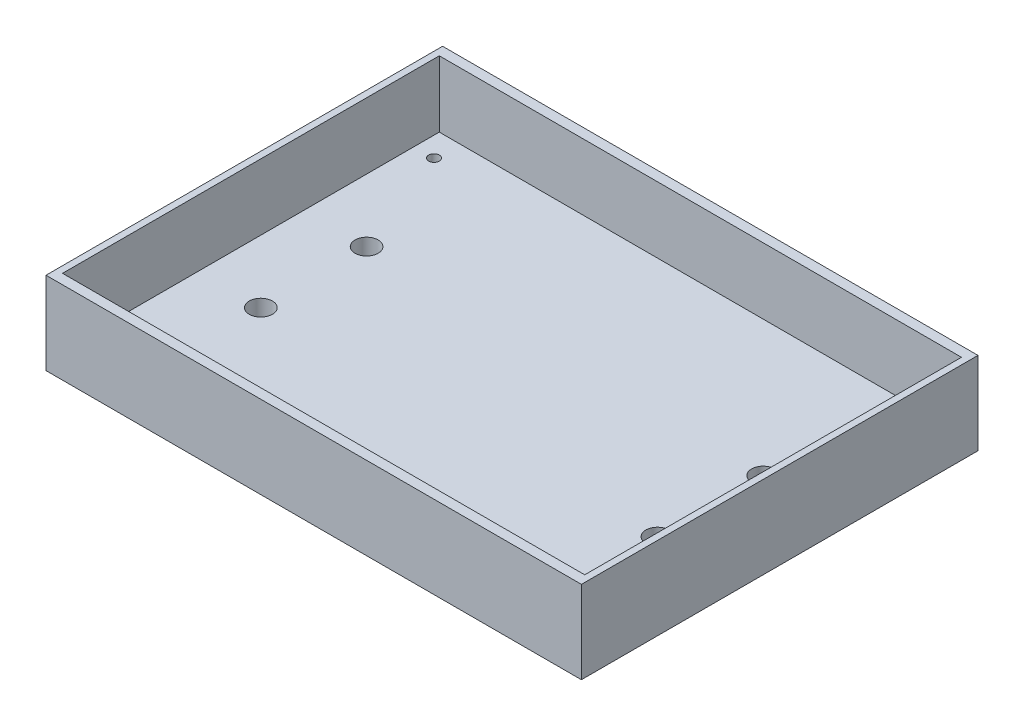
ISO-10303-21;
HEADER;
FILE_DESCRIPTION(('STEP AP214'),'2;1');
FILE_NAME('part.step','',(''),(''),'','','');
FILE_SCHEMA(('AUTOMOTIVE_DESIGN { 1 0 10303 214 1 1 1 1 }'));
ENDSEC;
DATA;
#1=APPLICATION_CONTEXT('core data for automotive mechanical design processes');
#2=APPLICATION_PROTOCOL_DEFINITION('international standard','automotive_design',2000,#1);
#3=PRODUCT_CONTEXT('',#1,'mechanical');
#4=PRODUCT('Part','Part','',(#3));
#5=PRODUCT_RELATED_PRODUCT_CATEGORY('part','',(#4));
#6=PRODUCT_DEFINITION_FORMATION('','',#4);
#7=PRODUCT_DEFINITION_CONTEXT('part definition',#1,'design');
#8=PRODUCT_DEFINITION('design','',#6,#7);
#9=PRODUCT_DEFINITION_SHAPE('','',#8);
#10=(LENGTH_UNIT() NAMED_UNIT(*) SI_UNIT(.MILLI.,.METRE.));
#11=(NAMED_UNIT(*) PLANE_ANGLE_UNIT() SI_UNIT($,.RADIAN.));
#12=(NAMED_UNIT(*) SI_UNIT($,.STERADIAN.) SOLID_ANGLE_UNIT());
#13=UNCERTAINTY_MEASURE_WITH_UNIT(LENGTH_MEASURE(1.E-05),#10,'distance_accuracy_value','');
#14=(GEOMETRIC_REPRESENTATION_CONTEXT(3) GLOBAL_UNCERTAINTY_ASSIGNED_CONTEXT((#13)) GLOBAL_UNIT_ASSIGNED_CONTEXT((#10,
#11,#12)) REPRESENTATION_CONTEXT('',''));
#15=CARTESIAN_POINT('',(0.,0.,0.));
#16=DIRECTION('',(0.,0.,1.));
#17=DIRECTION('',(1.,0.,0.));
#18=AXIS2_PLACEMENT_3D('',#15,#16,#17);
#19=CARTESIAN_POINT('',(0.,3.175,38.1));
#20=DIRECTION('',(0.,0.,-1.));
#21=DIRECTION('',(-1.,0.,0.));
#22=AXIS2_PLACEMENT_3D('',#19,#20,#21);
#23=PLANE('',#22);
#24=DIRECTION('',(1.,0.,0.));
#25=VECTOR('',#24,1.);
#26=CARTESIAN_POINT('',(0.,0.,38.1));
#27=LINE('',#26,#25);
#28=CARTESIAN_POINT('',(-51.435,0.,38.1));
#29=VERTEX_POINT('',#28);
#30=CARTESIAN_POINT('',(51.435,0.,38.1));
#31=VERTEX_POINT('',#30);
#32=EDGE_CURVE('E215',#29,#31,#27,.T.);
#33=ORIENTED_EDGE('',*,*,#32,.T.);
#34=DIRECTION('',(0.,-1.,0.));
#35=VECTOR('',#34,1.);
#36=CARTESIAN_POINT('',(51.435,3.175,38.1));
#37=LINE('',#36,#35);
#38=CARTESIAN_POINT('',(51.435,15.875,38.1));
#39=VERTEX_POINT('',#38);
#40=EDGE_CURVE('E11',#39,#31,#37,.T.);
#41=ORIENTED_EDGE('',*,*,#40,.F.);
#42=DIRECTION('',(1.,0.,0.));
#43=VECTOR('',#42,1.);
#44=CARTESIAN_POINT('',(51.435,15.875,38.1));
#45=LINE('',#44,#43);
#46=CARTESIAN_POINT('',(-51.435,15.875,38.1));
#47=VERTEX_POINT('',#46);
#48=EDGE_CURVE('E161',#47,#39,#45,.T.);
#49=ORIENTED_EDGE('',*,*,#48,.F.);
#50=DIRECTION('',(0.,-1.,0.));
#51=VECTOR('',#50,1.);
#52=CARTESIAN_POINT('',(-51.435,3.175,38.1));
#53=LINE('',#52,#51);
#54=EDGE_CURVE('E207',#47,#29,#53,.T.);
#55=ORIENTED_EDGE('',*,*,#54,.T.);
#56=EDGE_LOOP('',(#33,#41,#49,#55));
#57=FACE_BOUND('',#56,.T.);
#58=ADVANCED_FACE('F45',(#57),#23,.F.);
#59=CARTESIAN_POINT('',(51.435,3.175,0.));
#60=DIRECTION('',(1.,0.,0.));
#61=DIRECTION('',(0.,0.,-1.));
#62=AXIS2_PLACEMENT_3D('',#59,#60,#61);
#63=PLANE('',#62);
#64=DIRECTION('',(0.,0.,1.));
#65=VECTOR('',#64,1.);
#66=CARTESIAN_POINT('',(51.435,0.,0.));
#67=LINE('',#66,#65);
#68=CARTESIAN_POINT('',(51.435,0.,-38.1));
#69=VERTEX_POINT('',#68);
#70=EDGE_CURVE('E219',#69,#31,#67,.T.);
#71=ORIENTED_EDGE('',*,*,#70,.F.);
#72=DIRECTION('',(0.,-1.,0.));
#73=VECTOR('',#72,1.);
#74=CARTESIAN_POINT('',(51.435,3.175,-38.1));
#75=LINE('',#74,#73);
#76=CARTESIAN_POINT('',(51.435,15.875,-38.1));
#77=VERTEX_POINT('',#76);
#78=EDGE_CURVE('E54',#77,#69,#75,.T.);
#79=ORIENTED_EDGE('',*,*,#78,.F.);
#80=DIRECTION('',(0.,0.,-1.));
#81=VECTOR('',#80,1.);
#82=CARTESIAN_POINT('',(51.435,15.875,38.1));
#83=LINE('',#82,#81);
#84=EDGE_CURVE('E165',#39,#77,#83,.T.);
#85=ORIENTED_EDGE('',*,*,#84,.F.);
#86=ORIENTED_EDGE('',*,*,#40,.T.);
#87=EDGE_LOOP('',(#71,#79,#85,#86));
#88=FACE_BOUND('',#87,.T.);
#89=ADVANCED_FACE('F266',(#88),#63,.T.);
#90=CARTESIAN_POINT('',(0.,3.175,-38.1));
#91=DIRECTION('',(0.,0.,-1.));
#92=DIRECTION('',(-1.,0.,0.));
#93=AXIS2_PLACEMENT_3D('',#90,#91,#92);
#94=PLANE('',#93);
#95=DIRECTION('',(1.,0.,0.));
#96=VECTOR('',#95,1.);
#97=CARTESIAN_POINT('',(0.,0.,-38.1));
#98=LINE('',#97,#96);
#99=CARTESIAN_POINT('',(-51.435,0.,-38.1));
#100=VERTEX_POINT('',#99);
#101=EDGE_CURVE('E223',#100,#69,#98,.T.);
#102=ORIENTED_EDGE('',*,*,#101,.F.);
#103=DIRECTION('',(0.,-1.,0.));
#104=VECTOR('',#103,1.);
#105=CARTESIAN_POINT('',(-51.435,3.175,-38.1));
#106=LINE('',#105,#104);
#107=CARTESIAN_POINT('',(-51.435,15.875,-38.1));
#108=VERTEX_POINT('',#107);
#109=EDGE_CURVE('E256',#108,#100,#106,.T.);
#110=ORIENTED_EDGE('',*,*,#109,.F.);
#111=DIRECTION('',(-1.,0.,0.));
#112=VECTOR('',#111,1.);
#113=CARTESIAN_POINT('',(51.435,15.875,-38.1));
#114=LINE('',#113,#112);
#115=EDGE_CURVE('E169',#77,#108,#114,.T.);
#116=ORIENTED_EDGE('',*,*,#115,.F.);
#117=ORIENTED_EDGE('',*,*,#78,.T.);
#118=EDGE_LOOP('',(#102,#110,#116,#117));
#119=FACE_BOUND('',#118,.T.);
#120=ADVANCED_FACE('F263',(#119),#94,.T.);
#121=CARTESIAN_POINT('',(46.355,3.175,31.369));
#122=DIRECTION('',(0.,-1.,0.));
#123=DIRECTION('',(0.,0.,-1.));
#124=AXIS2_PLACEMENT_3D('',#121,#122,#123);
#125=CYLINDRICAL_SURFACE('',#124,1.01599999999998);
#126=CARTESIAN_POINT('',(46.355,3.175,31.369));
#127=DIRECTION('',(0.,1.,0.));
#128=DIRECTION('',(0.,0.,1.));
#129=AXIS2_PLACEMENT_3D('',#126,#127,#128);
#130=CIRCLE('',#129,1.01599999999998);
#131=CARTESIAN_POINT('',(46.355,3.175,32.385));
#132=VERTEX_POINT('',#131);
#133=EDGE_CURVE('E199',#132,#132,#130,.T.);
#134=ORIENTED_EDGE('',*,*,#133,.T.);
#135=EDGE_LOOP('',(#134));
#136=FACE_BOUND('',#135,.T.);
#137=CARTESIAN_POINT('',(46.355,0.,31.369));
#138=DIRECTION('',(0.,1.,0.));
#139=DIRECTION('',(0.,0.,1.));
#140=AXIS2_PLACEMENT_3D('',#137,#138,#139);
#141=CIRCLE('',#140,1.01599999999998);
#142=CARTESIAN_POINT('',(46.355,0.,32.385));
#143=VERTEX_POINT('',#142);
#144=EDGE_CURVE('E246',#143,#143,#141,.T.);
#145=ORIENTED_EDGE('',*,*,#144,.F.);
#146=EDGE_LOOP('',(#145));
#147=FACE_BOUND('',#146,.T.);
#148=ADVANCED_FACE('F334',(#136,#147),#125,.F.);
#149=CARTESIAN_POINT('',(-46.355,3.175,31.369));
#150=DIRECTION('',(0.,-1.,0.));
#151=DIRECTION('',(0.,0.,-1.));
#152=AXIS2_PLACEMENT_3D('',#149,#150,#151);
#153=CYLINDRICAL_SURFACE('',#152,1.016);
#154=CARTESIAN_POINT('',(-46.355,3.175,31.369));
#155=DIRECTION('',(0.,1.,0.));
#156=DIRECTION('',(0.,0.,1.));
#157=AXIS2_PLACEMENT_3D('',#154,#155,#156);
#158=CIRCLE('',#157,1.016);
#159=CARTESIAN_POINT('',(-46.355,3.175,32.385));
#160=VERTEX_POINT('',#159);
#161=EDGE_CURVE('E195',#160,#160,#158,.F.);
#162=ORIENTED_EDGE('',*,*,#161,.F.);
#163=EDGE_LOOP('',(#162));
#164=FACE_BOUND('',#163,.T.);
#165=CARTESIAN_POINT('',(-46.355,0.,31.369));
#166=DIRECTION('',(0.,1.,0.));
#167=DIRECTION('',(0.,0.,1.));
#168=AXIS2_PLACEMENT_3D('',#165,#166,#167);
#169=CIRCLE('',#168,1.016);
#170=CARTESIAN_POINT('',(-46.355,0.,32.385));
#171=VERTEX_POINT('',#170);
#172=EDGE_CURVE('E242',#171,#171,#169,.F.);
#173=ORIENTED_EDGE('',*,*,#172,.T.);
#174=EDGE_LOOP('',(#173));
#175=FACE_BOUND('',#174,.T.);
#176=ADVANCED_FACE('F337',(#164,#175),#153,.F.);
#177=CARTESIAN_POINT('',(-46.355,3.175,-31.369));
#178=DIRECTION('',(0.,-1.,0.));
#179=DIRECTION('',(0.,0.,-1.));
#180=AXIS2_PLACEMENT_3D('',#177,#178,#179);
#181=CYLINDRICAL_SURFACE('',#180,1.016);
#182=CARTESIAN_POINT('',(-46.355,3.175,-31.369));
#183=DIRECTION('',(0.,1.,0.));
#184=DIRECTION('',(0.,0.,1.));
#185=AXIS2_PLACEMENT_3D('',#182,#183,#184);
#186=CIRCLE('',#185,1.016);
#187=CARTESIAN_POINT('',(-46.355,3.175,-30.353));
#188=VERTEX_POINT('',#187);
#189=EDGE_CURVE('E191',#188,#188,#186,.T.);
#190=ORIENTED_EDGE('',*,*,#189,.T.);
#191=EDGE_LOOP('',(#190));
#192=FACE_BOUND('',#191,.T.);
#193=CARTESIAN_POINT('',(-46.355,0.,-31.369));
#194=DIRECTION('',(0.,1.,0.));
#195=DIRECTION('',(0.,0.,1.));
#196=AXIS2_PLACEMENT_3D('',#193,#194,#195);
#197=CIRCLE('',#196,1.016);
#198=CARTESIAN_POINT('',(-46.355,0.,-30.353));
#199=VERTEX_POINT('',#198);
#200=EDGE_CURVE('E238',#199,#199,#197,.T.);
#201=ORIENTED_EDGE('',*,*,#200,.F.);
#202=EDGE_LOOP('',(#201));
#203=FACE_BOUND('',#202,.T.);
#204=ADVANCED_FACE('F341',(#192,#203),#181,.F.);
#205=CARTESIAN_POINT('',(38.1,3.175,-10.16));
#206=DIRECTION('',(0.,-1.,0.));
#207=DIRECTION('',(0.,0.,-1.));
#208=AXIS2_PLACEMENT_3D('',#205,#206,#207);
#209=CYLINDRICAL_SURFACE('',#208,2.22249999999999);
#210=CARTESIAN_POINT('',(38.1,3.175,-10.16));
#211=DIRECTION('',(0.,1.,0.));
#212=DIRECTION('',(0.,0.,1.));
#213=AXIS2_PLACEMENT_3D('',#210,#211,#212);
#214=CIRCLE('',#213,2.22249999999999);
#215=CARTESIAN_POINT('',(38.1,3.175,-7.93750000000002));
#216=VERTEX_POINT('',#215);
#217=EDGE_CURVE('E187',#216,#216,#214,.F.);
#218=ORIENTED_EDGE('',*,*,#217,.F.);
#219=EDGE_LOOP('',(#218));
#220=FACE_BOUND('',#219,.T.);
#221=CARTESIAN_POINT('',(38.1,0.,-10.16));
#222=DIRECTION('',(0.,1.,0.));
#223=DIRECTION('',(0.,0.,1.));
#224=AXIS2_PLACEMENT_3D('',#221,#222,#223);
#225=CIRCLE('',#224,2.22249999999999);
#226=CARTESIAN_POINT('',(38.1,0.,-7.93750000000002));
#227=VERTEX_POINT('',#226);
#228=EDGE_CURVE('E234',#227,#227,#225,.F.);
#229=ORIENTED_EDGE('',*,*,#228,.T.);
#230=EDGE_LOOP('',(#229));
#231=FACE_BOUND('',#230,.T.);
#232=ADVANCED_FACE('F345',(#220,#231),#209,.F.);
#233=CARTESIAN_POINT('',(38.1,3.175,10.16));
#234=DIRECTION('',(0.,-1.,0.));
#235=DIRECTION('',(0.,0.,-1.));
#236=AXIS2_PLACEMENT_3D('',#233,#234,#235);
#237=CYLINDRICAL_SURFACE('',#236,2.22249999999999);
#238=CARTESIAN_POINT('',(38.1,3.175,10.16));
#239=DIRECTION('',(0.,1.,0.));
#240=DIRECTION('',(0.,0.,1.));
#241=AXIS2_PLACEMENT_3D('',#238,#239,#240);
#242=CIRCLE('',#241,2.22249999999999);
#243=CARTESIAN_POINT('',(38.1,3.175,12.3825));
#244=VERTEX_POINT('',#243);
#245=EDGE_CURVE('E183',#244,#244,#242,.T.);
#246=ORIENTED_EDGE('',*,*,#245,.T.);
#247=EDGE_LOOP('',(#246));
#248=FACE_BOUND('',#247,.T.);
#249=CARTESIAN_POINT('',(38.1,0.,10.16));
#250=DIRECTION('',(0.,1.,0.));
#251=DIRECTION('',(0.,0.,1.));
#252=AXIS2_PLACEMENT_3D('',#249,#250,#251);
#253=CIRCLE('',#252,2.22249999999999);
#254=CARTESIAN_POINT('',(38.1,0.,12.3825));
#255=VERTEX_POINT('',#254);
#256=EDGE_CURVE('E230',#255,#255,#253,.T.);
#257=ORIENTED_EDGE('',*,*,#256,.F.);
#258=EDGE_LOOP('',(#257));
#259=FACE_BOUND('',#258,.T.);
#260=ADVANCED_FACE('F305',(#248,#259),#237,.F.);
#261=CARTESIAN_POINT('',(-51.435,3.175,0.));
#262=DIRECTION('',(1.,0.,0.));
#263=DIRECTION('',(0.,0.,-1.));
#264=AXIS2_PLACEMENT_3D('',#261,#262,#263);
#265=PLANE('',#264);
#266=DIRECTION('',(0.,0.,1.));
#267=VECTOR('',#266,1.);
#268=CARTESIAN_POINT('',(-51.435,0.,0.));
#269=LINE('',#268,#267);
#270=EDGE_CURVE('E227',#100,#29,#269,.T.);
#271=ORIENTED_EDGE('',*,*,#270,.T.);
#272=ORIENTED_EDGE('',*,*,#54,.F.);
#273=DIRECTION('',(0.,0.,1.));
#274=VECTOR('',#273,1.);
#275=CARTESIAN_POINT('',(-51.435,15.875,38.1));
#276=LINE('',#275,#274);
#277=EDGE_CURVE('E126',#108,#47,#276,.T.);
#278=ORIENTED_EDGE('',*,*,#277,.F.);
#279=ORIENTED_EDGE('',*,*,#109,.T.);
#280=EDGE_LOOP('',(#271,#272,#278,#279));
#281=FACE_BOUND('',#280,.T.);
#282=ADVANCED_FACE('F273',(#281),#265,.F.);
#283=CARTESIAN_POINT('',(-38.1,3.175,-10.16));
#284=DIRECTION('',(0.,-1.,0.));
#285=DIRECTION('',(0.,0.,-1.));
#286=AXIS2_PLACEMENT_3D('',#283,#284,#285);
#287=CYLINDRICAL_SURFACE('',#286,2.2225);
#288=CARTESIAN_POINT('',(-38.1,3.175,-10.16));
#289=DIRECTION('',(0.,1.,0.));
#290=DIRECTION('',(0.,0.,1.));
#291=AXIS2_PLACEMENT_3D('',#288,#289,#290);
#292=CIRCLE('',#291,2.2225);
#293=CARTESIAN_POINT('',(-38.1,3.175,-7.9375));
#294=VERTEX_POINT('',#293);
#295=EDGE_CURVE('E178',#294,#294,#292,.T.);
#296=ORIENTED_EDGE('',*,*,#295,.T.);
#297=EDGE_LOOP('',(#296));
#298=FACE_BOUND('',#297,.T.);
#299=CARTESIAN_POINT('',(-38.1,0.,-10.16));
#300=DIRECTION('',(0.,1.,0.));
#301=DIRECTION('',(0.,0.,1.));
#302=AXIS2_PLACEMENT_3D('',#299,#300,#301);
#303=CIRCLE('',#302,2.2225);
#304=CARTESIAN_POINT('',(-38.1,0.,-7.9375));
#305=VERTEX_POINT('',#304);
#306=EDGE_CURVE('E211',#305,#305,#303,.T.);
#307=ORIENTED_EDGE('',*,*,#306,.F.);
#308=EDGE_LOOP('',(#307));
#309=FACE_BOUND('',#308,.T.);
#310=ADVANCED_FACE('F296',(#298,#309),#287,.F.);
#311=CARTESIAN_POINT('',(-38.1,3.175,10.16));
#312=DIRECTION('',(0.,-1.,0.));
#313=DIRECTION('',(0.,0.,-1.));
#314=AXIS2_PLACEMENT_3D('',#311,#312,#313);
#315=CYLINDRICAL_SURFACE('',#314,2.2225);
#316=CARTESIAN_POINT('',(-38.1,3.175,10.16));
#317=DIRECTION('',(0.,1.,0.));
#318=DIRECTION('',(0.,0.,1.));
#319=AXIS2_PLACEMENT_3D('',#316,#317,#318);
#320=CIRCLE('',#319,2.2225);
#321=CARTESIAN_POINT('',(-38.1,3.175,12.3825));
#322=VERTEX_POINT('',#321);
#323=EDGE_CURVE('E174',#322,#322,#320,.F.);
#324=ORIENTED_EDGE('',*,*,#323,.F.);
#325=EDGE_LOOP('',(#324));
#326=FACE_BOUND('',#325,.T.);
#327=CARTESIAN_POINT('',(-38.1,0.,10.16));
#328=DIRECTION('',(0.,1.,0.));
#329=DIRECTION('',(0.,0.,1.));
#330=AXIS2_PLACEMENT_3D('',#327,#328,#329);
#331=CIRCLE('',#330,2.2225);
#332=CARTESIAN_POINT('',(-38.1,0.,12.3825));
#333=VERTEX_POINT('',#332);
#334=EDGE_CURVE('E173',#333,#333,#331,.F.);
#335=ORIENTED_EDGE('',*,*,#334,.T.);
#336=EDGE_LOOP('',(#335));
#337=FACE_BOUND('',#336,.T.);
#338=ADVANCED_FACE('F47',(#326,#337),#315,.F.);
#339=CARTESIAN_POINT('',(46.355,3.175,-31.369));
#340=DIRECTION('',(0.,-1.,0.));
#341=DIRECTION('',(0.,0.,-1.));
#342=AXIS2_PLACEMENT_3D('',#339,#340,#341);
#343=CYLINDRICAL_SURFACE('',#342,1.01599999999998);
#344=CARTESIAN_POINT('',(46.355,3.175,-31.369));
#345=DIRECTION('',(0.,1.,0.));
#346=DIRECTION('',(0.,0.,1.));
#347=AXIS2_PLACEMENT_3D('',#344,#345,#346);
#348=CIRCLE('',#347,1.01599999999998);
#349=CARTESIAN_POINT('',(46.355,3.175,-30.353));
#350=VERTEX_POINT('',#349);
#351=EDGE_CURVE('E203',#350,#350,#348,.F.);
#352=ORIENTED_EDGE('',*,*,#351,.F.);
#353=EDGE_LOOP('',(#352));
#354=FACE_BOUND('',#353,.T.);
#355=CARTESIAN_POINT('',(46.355,0.,-31.369));
#356=DIRECTION('',(0.,1.,0.));
#357=DIRECTION('',(0.,0.,1.));
#358=AXIS2_PLACEMENT_3D('',#355,#356,#357);
#359=CIRCLE('',#358,1.01599999999998);
#360=CARTESIAN_POINT('',(46.355,0.,-30.353));
#361=VERTEX_POINT('',#360);
#362=EDGE_CURVE('E179',#361,#361,#359,.F.);
#363=ORIENTED_EDGE('',*,*,#362,.T.);
#364=EDGE_LOOP('',(#363));
#365=FACE_BOUND('',#364,.T.);
#366=ADVANCED_FACE('F303',(#354,#365),#343,.F.);
#367=CARTESIAN_POINT('',(0.,3.175,0.));
#368=DIRECTION('',(0.,1.,0.));
#369=DIRECTION('',(0.,0.,1.));
#370=AXIS2_PLACEMENT_3D('',#367,#368,#369);
#371=PLANE('',#370);
#372=DIRECTION('',(0.,0.,-1.));
#373=VECTOR('',#372,1.);
#374=CARTESIAN_POINT('',(50.165,3.175,36.195));
#375=LINE('',#374,#373);
#376=CARTESIAN_POINT('',(50.165,3.175,36.195));
#377=VERTEX_POINT('',#376);
#378=CARTESIAN_POINT('',(50.165,3.175,-36.195));
#379=VERTEX_POINT('',#378);
#380=EDGE_CURVE('E61',#377,#379,#375,.T.);
#381=ORIENTED_EDGE('',*,*,#380,.T.);
#382=DIRECTION('',(-1.,0.,0.));
#383=VECTOR('',#382,1.);
#384=CARTESIAN_POINT('',(-50.165,3.175,-36.195));
#385=LINE('',#384,#383);
#386=CARTESIAN_POINT('',(-50.165,3.175,-36.195));
#387=VERTEX_POINT('',#386);
#388=EDGE_CURVE('E65',#379,#387,#385,.T.);
#389=ORIENTED_EDGE('',*,*,#388,.T.);
#390=DIRECTION('',(0.,0.,1.));
#391=VECTOR('',#390,1.);
#392=CARTESIAN_POINT('',(-50.165,3.175,36.195));
#393=LINE('',#392,#391);
#394=CARTESIAN_POINT('',(-50.165,3.175,36.195));
#395=VERTEX_POINT('',#394);
#396=EDGE_CURVE('E145',#387,#395,#393,.T.);
#397=ORIENTED_EDGE('',*,*,#396,.T.);
#398=DIRECTION('',(1.,0.,0.));
#399=VECTOR('',#398,1.);
#400=CARTESIAN_POINT('',(-50.165,3.175,36.195));
#401=LINE('',#400,#399);
#402=EDGE_CURVE('E120',#395,#377,#401,.T.);
#403=ORIENTED_EDGE('',*,*,#402,.T.);
#404=EDGE_LOOP('',(#381,#389,#397,#403));
#405=FACE_BOUND('',#404,.T.);
#406=ORIENTED_EDGE('',*,*,#323,.T.);
#407=EDGE_LOOP('',(#406));
#408=FACE_BOUND('',#407,.T.);
#409=ORIENTED_EDGE('',*,*,#295,.F.);
#410=EDGE_LOOP('',(#409));
#411=FACE_BOUND('',#410,.T.);
#412=ORIENTED_EDGE('',*,*,#245,.F.);
#413=EDGE_LOOP('',(#412));
#414=FACE_BOUND('',#413,.T.);
#415=ORIENTED_EDGE('',*,*,#217,.T.);
#416=EDGE_LOOP('',(#415));
#417=FACE_BOUND('',#416,.T.);
#418=ORIENTED_EDGE('',*,*,#189,.F.);
#419=EDGE_LOOP('',(#418));
#420=FACE_BOUND('',#419,.T.);
#421=ORIENTED_EDGE('',*,*,#161,.T.);
#422=EDGE_LOOP('',(#421));
#423=FACE_BOUND('',#422,.T.);
#424=ORIENTED_EDGE('',*,*,#133,.F.);
#425=EDGE_LOOP('',(#424));
#426=FACE_BOUND('',#425,.T.);
#427=ORIENTED_EDGE('',*,*,#351,.T.);
#428=EDGE_LOOP('',(#427));
#429=FACE_BOUND('',#428,.T.);
#430=ADVANCED_FACE('F285',(#405,#408,#411,#414,#417,#420,#423,#426,#429),#371,.T.);
#431=CARTESIAN_POINT('',(0.,0.,0.));
#432=DIRECTION('',(0.,1.,0.));
#433=DIRECTION('',(0.,0.,1.));
#434=AXIS2_PLACEMENT_3D('',#431,#432,#433);
#435=PLANE('',#434);
#436=ORIENTED_EDGE('',*,*,#334,.F.);
#437=EDGE_LOOP('',(#436));
#438=FACE_BOUND('',#437,.T.);
#439=ORIENTED_EDGE('',*,*,#306,.T.);
#440=EDGE_LOOP('',(#439));
#441=FACE_BOUND('',#440,.T.);
#442=ORIENTED_EDGE('',*,*,#32,.F.);
#443=ORIENTED_EDGE('',*,*,#270,.F.);
#444=ORIENTED_EDGE('',*,*,#101,.T.);
#445=ORIENTED_EDGE('',*,*,#70,.T.);
#446=EDGE_LOOP('',(#442,#443,#444,#445));
#447=FACE_BOUND('',#446,.T.);
#448=ORIENTED_EDGE('',*,*,#256,.T.);
#449=EDGE_LOOP('',(#448));
#450=FACE_BOUND('',#449,.T.);
#451=ORIENTED_EDGE('',*,*,#228,.F.);
#452=EDGE_LOOP('',(#451));
#453=FACE_BOUND('',#452,.T.);
#454=ORIENTED_EDGE('',*,*,#200,.T.);
#455=EDGE_LOOP('',(#454));
#456=FACE_BOUND('',#455,.T.);
#457=ORIENTED_EDGE('',*,*,#172,.F.);
#458=EDGE_LOOP('',(#457));
#459=FACE_BOUND('',#458,.T.);
#460=ORIENTED_EDGE('',*,*,#144,.T.);
#461=EDGE_LOOP('',(#460));
#462=FACE_BOUND('',#461,.T.);
#463=ORIENTED_EDGE('',*,*,#362,.F.);
#464=EDGE_LOOP('',(#463));
#465=FACE_BOUND('',#464,.T.);
#466=ADVANCED_FACE('F270',(#438,#441,#447,#450,#453,#456,#459,#462,#465),#435,.F.);
#467=CARTESIAN_POINT('',(0.,15.875,0.));
#468=DIRECTION('',(0.,1.,0.));
#469=DIRECTION('',(0.,0.,1.));
#470=AXIS2_PLACEMENT_3D('',#467,#468,#469);
#471=PLANE('',#470);
#472=ORIENTED_EDGE('',*,*,#277,.T.);
#473=ORIENTED_EDGE('',*,*,#48,.T.);
#474=ORIENTED_EDGE('',*,*,#84,.T.);
#475=ORIENTED_EDGE('',*,*,#115,.T.);
#476=EDGE_LOOP('',(#472,#473,#474,#475));
#477=FACE_BOUND('',#476,.T.);
#478=DIRECTION('',(-1.,0.,0.));
#479=VECTOR('',#478,1.);
#480=CARTESIAN_POINT('',(-50.165,15.875,-36.195));
#481=LINE('',#480,#479);
#482=CARTESIAN_POINT('',(50.165,15.875,-36.195));
#483=VERTEX_POINT('',#482);
#484=CARTESIAN_POINT('',(-50.165,15.875,-36.195));
#485=VERTEX_POINT('',#484);
#486=EDGE_CURVE('E119',#483,#485,#481,.T.);
#487=ORIENTED_EDGE('',*,*,#486,.F.);
#488=DIRECTION('',(0.,0.,-1.));
#489=VECTOR('',#488,1.);
#490=CARTESIAN_POINT('',(50.165,15.875,36.195));
#491=LINE('',#490,#489);
#492=CARTESIAN_POINT('',(50.165,15.875,36.195));
#493=VERTEX_POINT('',#492);
#494=EDGE_CURVE('E109',#493,#483,#491,.T.);
#495=ORIENTED_EDGE('',*,*,#494,.F.);
#496=DIRECTION('',(1.,0.,0.));
#497=VECTOR('',#496,1.);
#498=CARTESIAN_POINT('',(-50.165,15.875,36.195));
#499=LINE('',#498,#497);
#500=CARTESIAN_POINT('',(-50.165,15.875,36.195));
#501=VERTEX_POINT('',#500);
#502=EDGE_CURVE('E136',#501,#493,#499,.T.);
#503=ORIENTED_EDGE('',*,*,#502,.F.);
#504=DIRECTION('',(0.,0.,1.));
#505=VECTOR('',#504,1.);
#506=CARTESIAN_POINT('',(-50.165,15.875,36.195));
#507=LINE('',#506,#505);
#508=EDGE_CURVE('E132',#485,#501,#507,.T.);
#509=ORIENTED_EDGE('',*,*,#508,.F.);
#510=EDGE_LOOP('',(#487,#495,#503,#509));
#511=FACE_BOUND('',#510,.T.);
#512=ADVANCED_FACE('F130',(#477,#511),#471,.T.);
#513=CARTESIAN_POINT('',(50.165,15.875,36.195));
#514=DIRECTION('',(-1.,0.,0.));
#515=DIRECTION('',(0.,0.,1.));
#516=AXIS2_PLACEMENT_3D('',#513,#514,#515);
#517=PLANE('',#516);
#518=ORIENTED_EDGE('',*,*,#380,.F.);
#519=DIRECTION('',(0.,-1.,0.));
#520=VECTOR('',#519,1.);
#521=CARTESIAN_POINT('',(50.165,15.875,36.195));
#522=LINE('',#521,#520);
#523=EDGE_CURVE('E114',#493,#377,#522,.T.);
#524=ORIENTED_EDGE('',*,*,#523,.F.);
#525=ORIENTED_EDGE('',*,*,#494,.T.);
#526=DIRECTION('',(0.,-1.,0.));
#527=VECTOR('',#526,1.);
#528=CARTESIAN_POINT('',(50.165,15.875,-36.195));
#529=LINE('',#528,#527);
#530=EDGE_CURVE('E112',#483,#379,#529,.T.);
#531=ORIENTED_EDGE('',*,*,#530,.T.);
#532=EDGE_LOOP('',(#518,#524,#525,#531));
#533=FACE_BOUND('',#532,.T.);
#534=ADVANCED_FACE('F111',(#533),#517,.T.);
#535=CARTESIAN_POINT('',(-50.165,15.875,-36.195));
#536=DIRECTION('',(0.,0.,1.));
#537=DIRECTION('',(1.,0.,0.));
#538=AXIS2_PLACEMENT_3D('',#535,#536,#537);
#539=PLANE('',#538);
#540=ORIENTED_EDGE('',*,*,#388,.F.);
#541=ORIENTED_EDGE('',*,*,#530,.F.);
#542=ORIENTED_EDGE('',*,*,#486,.T.);
#543=DIRECTION('',(0.,-1.,0.));
#544=VECTOR('',#543,1.);
#545=CARTESIAN_POINT('',(-50.165,15.875,-36.195));
#546=LINE('',#545,#544);
#547=EDGE_CURVE('E127',#485,#387,#546,.T.);
#548=ORIENTED_EDGE('',*,*,#547,.T.);
#549=EDGE_LOOP('',(#540,#541,#542,#548));
#550=FACE_BOUND('',#549,.T.);
#551=ADVANCED_FACE('F123',(#550),#539,.T.);
#552=CARTESIAN_POINT('',(-50.165,15.875,36.195));
#553=DIRECTION('',(1.,0.,0.));
#554=DIRECTION('',(0.,0.,-1.));
#555=AXIS2_PLACEMENT_3D('',#552,#553,#554);
#556=PLANE('',#555);
#557=ORIENTED_EDGE('',*,*,#396,.F.);
#558=ORIENTED_EDGE('',*,*,#547,.F.);
#559=ORIENTED_EDGE('',*,*,#508,.T.);
#560=DIRECTION('',(0.,-1.,0.));
#561=VECTOR('',#560,1.);
#562=CARTESIAN_POINT('',(-50.165,15.875,36.195));
#563=LINE('',#562,#561);
#564=EDGE_CURVE('E152',#501,#395,#563,.T.);
#565=ORIENTED_EDGE('',*,*,#564,.T.);
#566=EDGE_LOOP('',(#557,#558,#559,#565));
#567=FACE_BOUND('',#566,.T.);
#568=ADVANCED_FACE('F411',(#567),#556,.T.);
#569=CARTESIAN_POINT('',(-50.165,15.875,36.195));
#570=DIRECTION('',(0.,0.,-1.));
#571=DIRECTION('',(-1.,0.,0.));
#572=AXIS2_PLACEMENT_3D('',#569,#570,#571);
#573=PLANE('',#572);
#574=ORIENTED_EDGE('',*,*,#402,.F.);
#575=ORIENTED_EDGE('',*,*,#564,.F.);
#576=ORIENTED_EDGE('',*,*,#502,.T.);
#577=ORIENTED_EDGE('',*,*,#523,.T.);
#578=EDGE_LOOP('',(#574,#575,#576,#577));
#579=FACE_BOUND('',#578,.T.);
#580=ADVANCED_FACE('F421',(#579),#573,.T.);
#581=CLOSED_SHELL('',(#58,#89,#120,#148,#176,#204,#232,#260,#282,#310,#338,#366,#430,#466,#512,
#534,#551,#568,#580));
#582=MANIFOLD_SOLID_BREP('B2',#581);
#583=ADVANCED_BREP_SHAPE_REPRESENTATION('',(#18,#582),#14);
#584=SHAPE_DEFINITION_REPRESENTATION(#9,#583);
ENDSEC;
END-ISO-10303-21;
